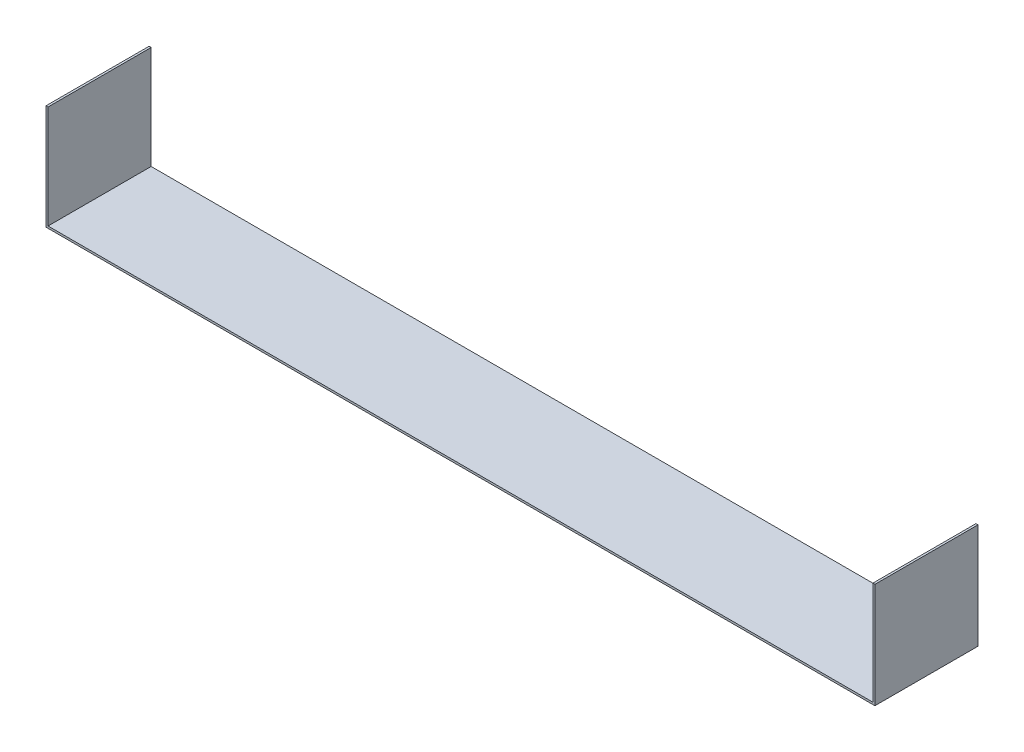
ISO-10303-21;
HEADER;
FILE_DESCRIPTION(('STEP AP214'),'2;1');
FILE_NAME('part.step','',(''),(''),'','','');
FILE_SCHEMA(('AUTOMOTIVE_DESIGN { 1 0 10303 214 1 1 1 1 }'));
ENDSEC;
DATA;
#1=APPLICATION_CONTEXT('core data for automotive mechanical design processes');
#2=APPLICATION_PROTOCOL_DEFINITION('international standard','automotive_design',2000,#1);
#3=PRODUCT_CONTEXT('',#1,'mechanical');
#4=PRODUCT('Part','Part','',(#3));
#5=PRODUCT_RELATED_PRODUCT_CATEGORY('part','',(#4));
#6=PRODUCT_DEFINITION_FORMATION('','',#4);
#7=PRODUCT_DEFINITION_CONTEXT('part definition',#1,'design');
#8=PRODUCT_DEFINITION('design','',#6,#7);
#9=PRODUCT_DEFINITION_SHAPE('','',#8);
#10=(LENGTH_UNIT() NAMED_UNIT(*) SI_UNIT(.MILLI.,.METRE.));
#11=(NAMED_UNIT(*) PLANE_ANGLE_UNIT() SI_UNIT($,.RADIAN.));
#12=(NAMED_UNIT(*) SI_UNIT($,.STERADIAN.) SOLID_ANGLE_UNIT());
#13=UNCERTAINTY_MEASURE_WITH_UNIT(LENGTH_MEASURE(1.E-05),#10,'distance_accuracy_value','');
#14=(GEOMETRIC_REPRESENTATION_CONTEXT(3) GLOBAL_UNCERTAINTY_ASSIGNED_CONTEXT((#13)) GLOBAL_UNIT_ASSIGNED_CONTEXT((#10,
#11,#12)) REPRESENTATION_CONTEXT('',''));
#15=CARTESIAN_POINT('',(0.,0.,0.));
#16=DIRECTION('',(0.,0.,1.));
#17=DIRECTION('',(1.,0.,0.));
#18=AXIS2_PLACEMENT_3D('',#15,#16,#17);
#19=CARTESIAN_POINT('',(-200.,0.,-10000.));
#20=DIRECTION('',(0.,1.,0.));
#21=DIRECTION('',(0.,0.,1.));
#22=AXIS2_PLACEMENT_3D('',#19,#20,#21);
#23=PLANE('',#22);
#24=DIRECTION('',(-1.,0.,0.));
#25=VECTOR('',#24,1.);
#26=CARTESIAN_POINT('',(-200.,0.,0.));
#27=LINE('',#26,#25);
#28=CARTESIAN_POINT('',(0.,0.,0.));
#29=VERTEX_POINT('',#28);
#30=CARTESIAN_POINT('',(-200.,0.,0.));
#31=VERTEX_POINT('',#30);
#32=EDGE_CURVE('E146',#29,#31,#27,.T.);
#33=ORIENTED_EDGE('',*,*,#32,.F.);
#34=DIRECTION('',(0.,0.,1.));
#35=VECTOR('',#34,1.);
#36=CARTESIAN_POINT('',(0.,0.,-10000.));
#37=LINE('',#36,#35);
#38=CARTESIAN_POINT('',(0.,0.,-10000.));
#39=VERTEX_POINT('',#38);
#40=EDGE_CURVE('E11',#39,#29,#37,.T.);
#41=ORIENTED_EDGE('',*,*,#40,.F.);
#42=DIRECTION('',(-1.,0.,0.));
#43=VECTOR('',#42,1.);
#44=CARTESIAN_POINT('',(-200.,0.,-10000.));
#45=LINE('',#44,#43);
#46=CARTESIAN_POINT('',(-200.,0.,-10000.));
#47=VERTEX_POINT('',#46);
#48=EDGE_CURVE('E174',#39,#47,#45,.T.);
#49=ORIENTED_EDGE('',*,*,#48,.T.);
#50=DIRECTION('',(0.,0.,1.));
#51=VECTOR('',#50,1.);
#52=CARTESIAN_POINT('',(-200.,0.,-10000.));
#53=LINE('',#52,#51);
#54=EDGE_CURVE('E46',#47,#31,#53,.T.);
#55=ORIENTED_EDGE('',*,*,#54,.T.);
#56=EDGE_LOOP('',(#33,#41,#49,#55));
#57=FACE_BOUND('',#56,.T.);
#58=ADVANCED_FACE('F43',(#57),#23,.T.);
#59=CARTESIAN_POINT('',(0.,0.,-10000.));
#60=DIRECTION('',(1.,0.,0.));
#61=DIRECTION('',(0.,1.,0.));
#62=AXIS2_PLACEMENT_3D('',#59,#60,#61);
#63=PLANE('',#62);
#64=DIRECTION('',(0.,1.,0.));
#65=VECTOR('',#64,1.);
#66=CARTESIAN_POINT('',(0.,0.,0.));
#67=LINE('',#66,#65);
#68=CARTESIAN_POINT('',(1.22464679914735E-12,-10000.,0.));
#69=VERTEX_POINT('',#68);
#70=EDGE_CURVE('E171',#69,#29,#67,.T.);
#71=ORIENTED_EDGE('',*,*,#70,.F.);
#72=DIRECTION('',(0.,0.,1.));
#73=VECTOR('',#72,1.);
#74=CARTESIAN_POINT('',(1.22464679914735E-12,-10000.,-10000.));
#75=LINE('',#74,#73);
#76=CARTESIAN_POINT('',(1.22464679914735E-12,-10000.,-10000.));
#77=VERTEX_POINT('',#76);
#78=EDGE_CURVE('E53',#77,#69,#75,.T.);
#79=ORIENTED_EDGE('',*,*,#78,.F.);
#80=DIRECTION('',(0.,1.,0.));
#81=VECTOR('',#80,1.);
#82=CARTESIAN_POINT('',(0.,0.,-10000.));
#83=LINE('',#82,#81);
#84=EDGE_CURVE('E132',#77,#39,#83,.T.);
#85=ORIENTED_EDGE('',*,*,#84,.T.);
#86=ORIENTED_EDGE('',*,*,#40,.T.);
#87=EDGE_LOOP('',(#71,#79,#85,#86));
#88=FACE_BOUND('',#87,.T.);
#89=ADVANCED_FACE('F192',(#88),#63,.T.);
#90=CARTESIAN_POINT('',(1.22464679914735E-12,-10000.,-10000.));
#91=DIRECTION('',(0.,1.,0.));
#92=DIRECTION('',(0.,0.,1.));
#93=AXIS2_PLACEMENT_3D('',#90,#91,#92);
#94=PLANE('',#93);
#95=DIRECTION('',(-1.,0.,0.));
#96=VECTOR('',#95,1.);
#97=CARTESIAN_POINT('',(1.22464679914735E-12,-10000.,0.));
#98=LINE('',#97,#96);
#99=CARTESIAN_POINT('',(80000.,-10000.,0.));
#100=VERTEX_POINT('',#99);
#101=EDGE_CURVE('E118',#100,#69,#98,.T.);
#102=ORIENTED_EDGE('',*,*,#101,.F.);
#103=DIRECTION('',(0.,0.,1.));
#104=VECTOR('',#103,1.);
#105=CARTESIAN_POINT('',(80000.,-10000.,-10000.));
#106=LINE('',#105,#104);
#107=CARTESIAN_POINT('',(80000.,-10000.,-10000.));
#108=VERTEX_POINT('',#107);
#109=EDGE_CURVE('E113',#108,#100,#106,.T.);
#110=ORIENTED_EDGE('',*,*,#109,.F.);
#111=DIRECTION('',(-1.,0.,0.));
#112=VECTOR('',#111,1.);
#113=CARTESIAN_POINT('',(1.22464679914735E-12,-10000.,-10000.));
#114=LINE('',#113,#112);
#115=EDGE_CURVE('E116',#108,#77,#114,.T.);
#116=ORIENTED_EDGE('',*,*,#115,.T.);
#117=ORIENTED_EDGE('',*,*,#78,.T.);
#118=EDGE_LOOP('',(#102,#110,#116,#117));
#119=FACE_BOUND('',#118,.T.);
#120=ADVANCED_FACE('F115',(#119),#94,.T.);
#121=CARTESIAN_POINT('',(80000.,-10000.,-10000.));
#122=DIRECTION('',(-1.,0.,0.));
#123=DIRECTION('',(0.,0.,1.));
#124=AXIS2_PLACEMENT_3D('',#121,#122,#123);
#125=PLANE('',#124);
#126=DIRECTION('',(0.,-1.,0.));
#127=VECTOR('',#126,1.);
#128=CARTESIAN_POINT('',(80000.,-10000.,0.));
#129=LINE('',#128,#127);
#130=CARTESIAN_POINT('',(80000.,0.,0.));
#131=VERTEX_POINT('',#130);
#132=EDGE_CURVE('E166',#131,#100,#129,.T.);
#133=ORIENTED_EDGE('',*,*,#132,.F.);
#134=DIRECTION('',(0.,0.,1.));
#135=VECTOR('',#134,1.);
#136=CARTESIAN_POINT('',(80000.,0.,-10000.));
#137=LINE('',#136,#135);
#138=CARTESIAN_POINT('',(80000.,0.,-10000.));
#139=VERTEX_POINT('',#138);
#140=EDGE_CURVE('E124',#139,#131,#137,.T.);
#141=ORIENTED_EDGE('',*,*,#140,.F.);
#142=DIRECTION('',(0.,-1.,0.));
#143=VECTOR('',#142,1.);
#144=CARTESIAN_POINT('',(80000.,-10000.,-10000.));
#145=LINE('',#144,#143);
#146=EDGE_CURVE('E130',#139,#108,#145,.T.);
#147=ORIENTED_EDGE('',*,*,#146,.T.);
#148=ORIENTED_EDGE('',*,*,#109,.T.);
#149=EDGE_LOOP('',(#133,#141,#147,#148));
#150=FACE_BOUND('',#149,.T.);
#151=ADVANCED_FACE('F135',(#150),#125,.T.);
#152=CARTESIAN_POINT('',(80000.,0.,-10000.));
#153=DIRECTION('',(0.,1.,0.));
#154=DIRECTION('',(0.,0.,1.));
#155=AXIS2_PLACEMENT_3D('',#152,#153,#154);
#156=PLANE('',#155);
#157=DIRECTION('',(-1.,0.,0.));
#158=VECTOR('',#157,1.);
#159=CARTESIAN_POINT('',(80000.,0.,0.));
#160=LINE('',#159,#158);
#161=CARTESIAN_POINT('',(80200.,0.,0.));
#162=VERTEX_POINT('',#161);
#163=EDGE_CURVE('E162',#162,#131,#160,.T.);
#164=ORIENTED_EDGE('',*,*,#163,.F.);
#165=DIRECTION('',(0.,0.,1.));
#166=VECTOR('',#165,1.);
#167=CARTESIAN_POINT('',(80200.,0.,-10000.));
#168=LINE('',#167,#166);
#169=CARTESIAN_POINT('',(80200.,0.,-10000.));
#170=VERTEX_POINT('',#169);
#171=EDGE_CURVE('E180',#170,#162,#168,.T.);
#172=ORIENTED_EDGE('',*,*,#171,.F.);
#173=DIRECTION('',(-1.,0.,0.));
#174=VECTOR('',#173,1.);
#175=CARTESIAN_POINT('',(80000.,0.,-10000.));
#176=LINE('',#175,#174);
#177=EDGE_CURVE('E137',#170,#139,#176,.T.);
#178=ORIENTED_EDGE('',*,*,#177,.T.);
#179=ORIENTED_EDGE('',*,*,#140,.T.);
#180=EDGE_LOOP('',(#164,#172,#178,#179));
#181=FACE_BOUND('',#180,.T.);
#182=ADVANCED_FACE('F205',(#181),#156,.T.);
#183=CARTESIAN_POINT('',(80200.,-10200.,-10000.));
#184=DIRECTION('',(1.,0.,0.));
#185=DIRECTION('',(0.,0.,-1.));
#186=AXIS2_PLACEMENT_3D('',#183,#184,#185);
#187=PLANE('',#186);
#188=DIRECTION('',(0.,1.,0.));
#189=VECTOR('',#188,1.);
#190=CARTESIAN_POINT('',(80200.,-10200.,0.));
#191=LINE('',#190,#189);
#192=CARTESIAN_POINT('',(80200.,-10200.,0.));
#193=VERTEX_POINT('',#192);
#194=EDGE_CURVE('E158',#193,#162,#191,.T.);
#195=ORIENTED_EDGE('',*,*,#194,.F.);
#196=DIRECTION('',(0.,0.,1.));
#197=VECTOR('',#196,1.);
#198=CARTESIAN_POINT('',(80200.,-10200.,-10000.));
#199=LINE('',#198,#197);
#200=CARTESIAN_POINT('',(80200.,-10200.,-10000.));
#201=VERTEX_POINT('',#200);
#202=EDGE_CURVE('E183',#201,#193,#199,.T.);
#203=ORIENTED_EDGE('',*,*,#202,.F.);
#204=DIRECTION('',(0.,1.,0.));
#205=VECTOR('',#204,1.);
#206=CARTESIAN_POINT('',(80200.,-10200.,-10000.));
#207=LINE('',#206,#205);
#208=EDGE_CURVE('E140',#201,#170,#207,.T.);
#209=ORIENTED_EDGE('',*,*,#208,.T.);
#210=ORIENTED_EDGE('',*,*,#171,.T.);
#211=EDGE_LOOP('',(#195,#203,#209,#210));
#212=FACE_BOUND('',#211,.T.);
#213=ADVANCED_FACE('F208',(#212),#187,.T.);
#214=CARTESIAN_POINT('',(-199.999999999998,-10200.,-10000.));
#215=DIRECTION('',(0.,-1.,0.));
#216=DIRECTION('',(1.,0.,0.));
#217=AXIS2_PLACEMENT_3D('',#214,#215,#216);
#218=PLANE('',#217);
#219=DIRECTION('',(1.,0.,0.));
#220=VECTOR('',#219,1.);
#221=CARTESIAN_POINT('',(-199.999999999998,-10200.,0.));
#222=LINE('',#221,#220);
#223=CARTESIAN_POINT('',(-199.999999999998,-10200.,0.));
#224=VERTEX_POINT('',#223);
#225=EDGE_CURVE('E154',#224,#193,#222,.T.);
#226=ORIENTED_EDGE('',*,*,#225,.F.);
#227=DIRECTION('',(0.,0.,1.));
#228=VECTOR('',#227,1.);
#229=CARTESIAN_POINT('',(-199.999999999998,-10200.,-10000.));
#230=LINE('',#229,#228);
#231=CARTESIAN_POINT('',(-199.999999999998,-10200.,-10000.));
#232=VERTEX_POINT('',#231);
#233=EDGE_CURVE('E185',#232,#224,#230,.T.);
#234=ORIENTED_EDGE('',*,*,#233,.F.);
#235=DIRECTION('',(1.,0.,0.));
#236=VECTOR('',#235,1.);
#237=CARTESIAN_POINT('',(-199.999999999998,-10200.,-10000.));
#238=LINE('',#237,#236);
#239=EDGE_CURVE('E303',#232,#201,#238,.T.);
#240=ORIENTED_EDGE('',*,*,#239,.T.);
#241=ORIENTED_EDGE('',*,*,#202,.T.);
#242=EDGE_LOOP('',(#226,#234,#240,#241));
#243=FACE_BOUND('',#242,.T.);
#244=ADVANCED_FACE('F212',(#243),#218,.T.);
#245=CARTESIAN_POINT('',(-200.,0.,-10000.));
#246=DIRECTION('',(-1.,0.,0.));
#247=DIRECTION('',(0.,-1.,0.));
#248=AXIS2_PLACEMENT_3D('',#245,#246,#247);
#249=PLANE('',#248);
#250=DIRECTION('',(0.,-1.,0.));
#251=VECTOR('',#250,1.);
#252=CARTESIAN_POINT('',(-200.,0.,0.));
#253=LINE('',#252,#251);
#254=EDGE_CURVE('E150',#31,#224,#253,.T.);
#255=ORIENTED_EDGE('',*,*,#254,.F.);
#256=ORIENTED_EDGE('',*,*,#54,.F.);
#257=DIRECTION('',(0.,-1.,0.));
#258=VECTOR('',#257,1.);
#259=CARTESIAN_POINT('',(-200.,0.,-10000.));
#260=LINE('',#259,#258);
#261=EDGE_CURVE('E306',#47,#232,#260,.T.);
#262=ORIENTED_EDGE('',*,*,#261,.T.);
#263=ORIENTED_EDGE('',*,*,#233,.T.);
#264=EDGE_LOOP('',(#255,#256,#262,#263));
#265=FACE_BOUND('',#264,.T.);
#266=ADVANCED_FACE('F189',(#265),#249,.T.);
#267=CARTESIAN_POINT('',(0.,0.,-10000.));
#268=DIRECTION('',(0.,0.,-1.));
#269=DIRECTION('',(-1.,0.,0.));
#270=AXIS2_PLACEMENT_3D('',#267,#268,#269);
#271=PLANE('',#270);
#272=ORIENTED_EDGE('',*,*,#48,.F.);
#273=ORIENTED_EDGE('',*,*,#84,.F.);
#274=ORIENTED_EDGE('',*,*,#115,.F.);
#275=ORIENTED_EDGE('',*,*,#146,.F.);
#276=ORIENTED_EDGE('',*,*,#177,.F.);
#277=ORIENTED_EDGE('',*,*,#208,.F.);
#278=ORIENTED_EDGE('',*,*,#239,.F.);
#279=ORIENTED_EDGE('',*,*,#261,.F.);
#280=EDGE_LOOP('',(#272,#273,#274,#275,#276,#277,#278,#279));
#281=FACE_BOUND('',#280,.T.);
#282=ADVANCED_FACE('F128',(#281),#271,.T.);
#283=CARTESIAN_POINT('',(0.,0.,0.));
#284=DIRECTION('',(0.,0.,-1.));
#285=DIRECTION('',(-1.,0.,0.));
#286=AXIS2_PLACEMENT_3D('',#283,#284,#285);
#287=PLANE('',#286);
#288=ORIENTED_EDGE('',*,*,#32,.T.);
#289=ORIENTED_EDGE('',*,*,#254,.T.);
#290=ORIENTED_EDGE('',*,*,#225,.T.);
#291=ORIENTED_EDGE('',*,*,#194,.T.);
#292=ORIENTED_EDGE('',*,*,#163,.T.);
#293=ORIENTED_EDGE('',*,*,#132,.T.);
#294=ORIENTED_EDGE('',*,*,#101,.T.);
#295=ORIENTED_EDGE('',*,*,#70,.T.);
#296=EDGE_LOOP('',(#288,#289,#290,#291,#292,#293,#294,#295));
#297=FACE_BOUND('',#296,.T.);
#298=ADVANCED_FACE('F191',(#297),#287,.F.);
#299=CLOSED_SHELL('',(#58,#89,#120,#151,#182,#213,#244,#266,#282,#298));
#300=MANIFOLD_SOLID_BREP('B2',#299);
#301=ADVANCED_BREP_SHAPE_REPRESENTATION('',(#18,#300),#14);
#302=SHAPE_DEFINITION_REPRESENTATION(#9,#301);
ENDSEC;
END-ISO-10303-21;
